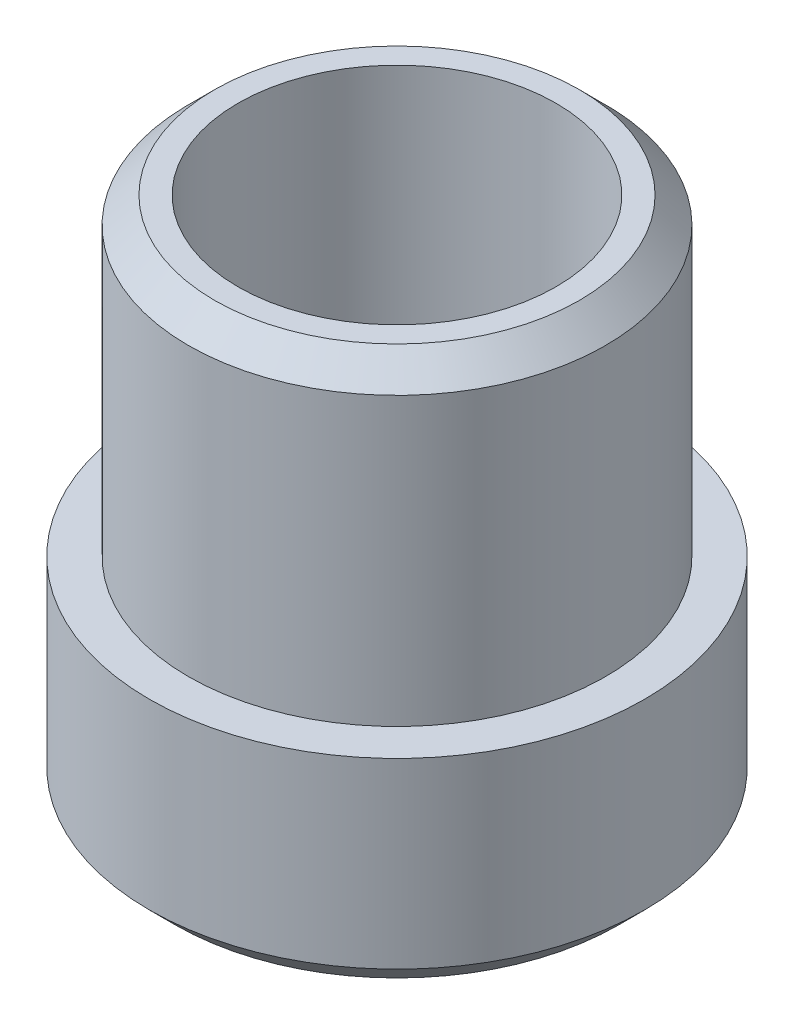
ISO-10303-21;
HEADER;
FILE_DESCRIPTION(('STEP AP214'),'2;1');
FILE_NAME('part.step','',(''),(''),'','','');
FILE_SCHEMA(('AUTOMOTIVE_DESIGN { 1 0 10303 214 1 1 1 1 }'));
ENDSEC;
DATA;
#1=APPLICATION_CONTEXT('core data for automotive mechanical design processes');
#2=APPLICATION_PROTOCOL_DEFINITION('international standard','automotive_design',2000,#1);
#3=PRODUCT_CONTEXT('',#1,'mechanical');
#4=PRODUCT('Part','Part','',(#3));
#5=PRODUCT_RELATED_PRODUCT_CATEGORY('part','',(#4));
#6=PRODUCT_DEFINITION_FORMATION('','',#4);
#7=PRODUCT_DEFINITION_CONTEXT('part definition',#1,'design');
#8=PRODUCT_DEFINITION('design','',#6,#7);
#9=PRODUCT_DEFINITION_SHAPE('','',#8);
#10=(LENGTH_UNIT() NAMED_UNIT(*) SI_UNIT(.MILLI.,.METRE.));
#11=(NAMED_UNIT(*) PLANE_ANGLE_UNIT() SI_UNIT($,.RADIAN.));
#12=(NAMED_UNIT(*) SI_UNIT($,.STERADIAN.) SOLID_ANGLE_UNIT());
#13=UNCERTAINTY_MEASURE_WITH_UNIT(LENGTH_MEASURE(1.E-05),#10,'distance_accuracy_value','');
#14=(GEOMETRIC_REPRESENTATION_CONTEXT(3) GLOBAL_UNCERTAINTY_ASSIGNED_CONTEXT((#13)) GLOBAL_UNIT_ASSIGNED_CONTEXT((#10,
#11,#12)) REPRESENTATION_CONTEXT('',''));
#15=CARTESIAN_POINT('',(0.,0.,0.));
#16=DIRECTION('',(0.,0.,1.));
#17=DIRECTION('',(1.,0.,0.));
#18=AXIS2_PLACEMENT_3D('',#15,#16,#17);
#19=CARTESIAN_POINT('',(0.,4.,0.));
#20=DIRECTION('',(0.,-1.,0.));
#21=DIRECTION('',(0.,0.,-1.));
#22=AXIS2_PLACEMENT_3D('',#19,#20,#21);
#23=CYLINDRICAL_SURFACE('',#22,4.75);
#24=CARTESIAN_POINT('',(0.,0.5,0.));
#25=DIRECTION('',(0.,1.,0.));
#26=DIRECTION('',(0.,0.,1.));
#27=AXIS2_PLACEMENT_3D('',#24,#25,#26);
#28=CIRCLE('',#27,4.75);
#29=CARTESIAN_POINT('',(0.,0.5,4.75));
#30=VERTEX_POINT('',#29);
#31=EDGE_CURVE('E46',#30,#30,#28,.T.);
#32=ORIENTED_EDGE('',*,*,#31,.T.);
#33=EDGE_LOOP('',(#32));
#34=FACE_BOUND('',#33,.T.);
#35=CARTESIAN_POINT('',(0.,4.,0.));
#36=DIRECTION('',(0.,1.,0.));
#37=DIRECTION('',(0.,0.,1.));
#38=AXIS2_PLACEMENT_3D('',#35,#36,#37);
#39=CIRCLE('',#38,4.75);
#40=CARTESIAN_POINT('',(0.,4.,4.75));
#41=VERTEX_POINT('',#40);
#42=EDGE_CURVE('E54',#41,#41,#39,.T.);
#43=ORIENTED_EDGE('',*,*,#42,.F.);
#44=EDGE_LOOP('',(#43));
#45=FACE_BOUND('',#44,.T.);
#46=ADVANCED_FACE('F31',(#34,#45),#23,.T.);
#47=CARTESIAN_POINT('',(0.,4.,0.));
#48=DIRECTION('',(0.,1.,0.));
#49=DIRECTION('',(0.,0.,1.));
#50=AXIS2_PLACEMENT_3D('',#47,#48,#49);
#51=PLANE('',#50);
#52=CARTESIAN_POINT('',(0.,4.,0.));
#53=DIRECTION('',(0.,1.,0.));
#54=DIRECTION('',(0.,0.,1.));
#55=AXIS2_PLACEMENT_3D('',#52,#53,#54);
#56=CIRCLE('',#55,4.);
#57=CARTESIAN_POINT('',(0.,4.,4.));
#58=VERTEX_POINT('',#57);
#59=EDGE_CURVE('E57',#58,#58,#56,.T.);
#60=ORIENTED_EDGE('',*,*,#59,.F.);
#61=EDGE_LOOP('',(#60));
#62=FACE_BOUND('',#61,.T.);
#63=ORIENTED_EDGE('',*,*,#42,.T.);
#64=EDGE_LOOP('',(#63));
#65=FACE_BOUND('',#64,.T.);
#66=ADVANCED_FACE('F77',(#62,#65),#51,.T.);
#67=CARTESIAN_POINT('',(0.,0.,0.));
#68=DIRECTION('',(0.,1.,0.));
#69=DIRECTION('',(0.,0.,1.));
#70=AXIS2_PLACEMENT_3D('',#67,#68,#69);
#71=PLANE('',#70);
#72=CARTESIAN_POINT('',(0.,0.,0.));
#73=DIRECTION('',(0.,1.,0.));
#74=DIRECTION('',(0.,0.,1.));
#75=AXIS2_PLACEMENT_3D('',#72,#73,#74);
#76=CIRCLE('',#75,4.25);
#77=CARTESIAN_POINT('',(0.,0.,4.25));
#78=VERTEX_POINT('',#77);
#79=EDGE_CURVE('E42',#78,#78,#76,.F.);
#80=ORIENTED_EDGE('',*,*,#79,.T.);
#81=EDGE_LOOP('',(#80));
#82=FACE_BOUND('',#81,.T.);
#83=ADVANCED_FACE('F70',(#82),#71,.F.);
#84=CARTESIAN_POINT('',(0.,10.,0.));
#85=DIRECTION('',(0.,1.,0.));
#86=DIRECTION('',(0.,0.,1.));
#87=AXIS2_PLACEMENT_3D('',#84,#85,#86);
#88=PLANE('',#87);
#89=CARTESIAN_POINT('',(0.,10.,0.));
#90=DIRECTION('',(0.,1.,0.));
#91=DIRECTION('',(0.,0.,1.));
#92=AXIS2_PLACEMENT_3D('',#89,#90,#91);
#93=CIRCLE('',#92,3.5);
#94=CARTESIAN_POINT('',(0.,10.,3.5));
#95=VERTEX_POINT('',#94);
#96=EDGE_CURVE('E38',#95,#95,#93,.T.);
#97=ORIENTED_EDGE('',*,*,#96,.T.);
#98=EDGE_LOOP('',(#97));
#99=FACE_BOUND('',#98,.T.);
#100=CARTESIAN_POINT('',(0.,10.,0.));
#101=DIRECTION('',(0.,1.,0.));
#102=DIRECTION('',(0.,0.,1.));
#103=AXIS2_PLACEMENT_3D('',#100,#101,#102);
#104=CIRCLE('',#103,3.05);
#105=CARTESIAN_POINT('',(0.,10.,3.05));
#106=VERTEX_POINT('',#105);
#107=EDGE_CURVE('E60',#106,#106,#104,.T.);
#108=ORIENTED_EDGE('',*,*,#107,.F.);
#109=EDGE_LOOP('',(#108));
#110=FACE_BOUND('',#109,.T.);
#111=ADVANCED_FACE('F67',(#99,#110),#88,.T.);
#112=CARTESIAN_POINT('',(0.,10.,0.));
#113=DIRECTION('',(0.,-1.,0.));
#114=DIRECTION('',(0.,0.,-1.));
#115=AXIS2_PLACEMENT_3D('',#112,#113,#114);
#116=CYLINDRICAL_SURFACE('',#115,4.);
#117=CARTESIAN_POINT('',(0.,9.5,0.));
#118=DIRECTION('',(0.,1.,0.));
#119=DIRECTION('',(0.,0.,1.));
#120=AXIS2_PLACEMENT_3D('',#117,#118,#119);
#121=CIRCLE('',#120,4.);
#122=CARTESIAN_POINT('',(0.,9.5,4.));
#123=VERTEX_POINT('',#122);
#124=EDGE_CURVE('E10',#123,#123,#121,.F.);
#125=ORIENTED_EDGE('',*,*,#124,.T.);
#126=EDGE_LOOP('',(#125));
#127=FACE_BOUND('',#126,.T.);
#128=ORIENTED_EDGE('',*,*,#59,.T.);
#129=EDGE_LOOP('',(#128));
#130=FACE_BOUND('',#129,.T.);
#131=ADVANCED_FACE('F69',(#127,#130),#116,.T.);
#132=CARTESIAN_POINT('',(0.,10.,0.));
#133=DIRECTION('',(0.,-1.,0.));
#134=DIRECTION('',(0.,0.,-1.));
#135=AXIS2_PLACEMENT_3D('',#132,#133,#134);
#136=CYLINDRICAL_SURFACE('',#135,3.05);
#137=ORIENTED_EDGE('',*,*,#107,.T.);
#138=EDGE_LOOP('',(#137));
#139=FACE_BOUND('',#138,.T.);
#140=CARTESIAN_POINT('',(0.,4.,0.));
#141=DIRECTION('',(0.,1.,0.));
#142=DIRECTION('',(0.,0.,1.));
#143=AXIS2_PLACEMENT_3D('',#140,#141,#142);
#144=CIRCLE('',#143,3.05);
#145=CARTESIAN_POINT('',(0.,4.,3.05));
#146=VERTEX_POINT('',#145);
#147=EDGE_CURVE('E51',#146,#146,#144,.F.);
#148=ORIENTED_EDGE('',*,*,#147,.T.);
#149=EDGE_LOOP('',(#148));
#150=FACE_BOUND('',#149,.T.);
#151=ADVANCED_FACE('F64',(#139,#150),#136,.F.);
#152=ORIENTED_EDGE('',*,*,#147,.F.);
#153=EDGE_LOOP('',(#152));
#154=FACE_BOUND('',#153,.T.);
#155=ADVANCED_FACE('F89',(#154),#51,.T.);
#156=CARTESIAN_POINT('',(0.,0.5,0.));
#157=DIRECTION('',(0.,1.,0.));
#158=DIRECTION('',(0.,0.,1.));
#159=AXIS2_PLACEMENT_3D('',#156,#157,#158);
#160=CONICAL_SURFACE('',#159,4.75,0.785398163397452);
#161=ORIENTED_EDGE('',*,*,#79,.F.);
#162=EDGE_LOOP('',(#161));
#163=FACE_BOUND('',#162,.T.);
#164=ORIENTED_EDGE('',*,*,#31,.F.);
#165=EDGE_LOOP('',(#164));
#166=FACE_BOUND('',#165,.T.);
#167=ADVANCED_FACE('F91',(#163,#166),#160,.T.);
#168=CARTESIAN_POINT('',(0.,10.,0.));
#169=DIRECTION('',(0.,-1.,0.));
#170=DIRECTION('',(0.,0.,-1.));
#171=AXIS2_PLACEMENT_3D('',#168,#169,#170);
#172=CONICAL_SURFACE('',#171,3.5,0.785398163397448);
#173=ORIENTED_EDGE('',*,*,#124,.F.);
#174=EDGE_LOOP('',(#173));
#175=FACE_BOUND('',#174,.T.);
#176=ORIENTED_EDGE('',*,*,#96,.F.);
#177=EDGE_LOOP('',(#176));
#178=FACE_BOUND('',#177,.T.);
#179=ADVANCED_FACE('F33',(#175,#178),#172,.T.);
#180=CLOSED_SHELL('',(#46,#66,#83,#111,#131,#151,#155,#167,#179));
#181=MANIFOLD_SOLID_BREP('B2',#180);
#182=ADVANCED_BREP_SHAPE_REPRESENTATION('',(#18,#181),#14);
#183=SHAPE_DEFINITION_REPRESENTATION(#9,#182);
ENDSEC;
END-ISO-10303-21;
